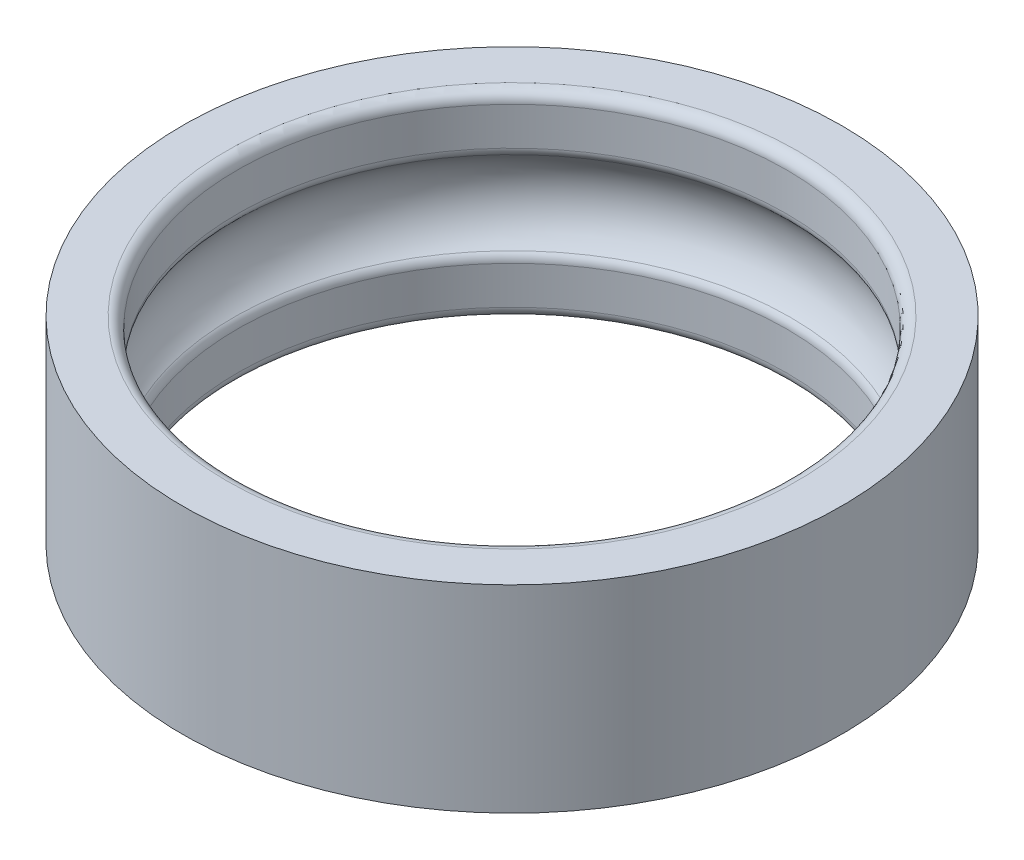
ISO-10303-21;
HEADER;
FILE_DESCRIPTION(('STEP AP214'),'2;1');
FILE_NAME('part.step','',(''),(''),'','','');
FILE_SCHEMA(('AUTOMOTIVE_DESIGN { 1 0 10303 214 1 1 1 1 }'));
ENDSEC;
DATA;
#1=APPLICATION_CONTEXT('core data for automotive mechanical design processes');
#2=APPLICATION_PROTOCOL_DEFINITION('international standard','automotive_design',2000,#1);
#3=PRODUCT_CONTEXT('',#1,'mechanical');
#4=PRODUCT('Part','Part','',(#3));
#5=PRODUCT_RELATED_PRODUCT_CATEGORY('part','',(#4));
#6=PRODUCT_DEFINITION_FORMATION('','',#4);
#7=PRODUCT_DEFINITION_CONTEXT('part definition',#1,'design');
#8=PRODUCT_DEFINITION('design','',#6,#7);
#9=PRODUCT_DEFINITION_SHAPE('','',#8);
#10=(LENGTH_UNIT() NAMED_UNIT(*) SI_UNIT(.MILLI.,.METRE.));
#11=(NAMED_UNIT(*) PLANE_ANGLE_UNIT() SI_UNIT($,.RADIAN.));
#12=(NAMED_UNIT(*) SI_UNIT($,.STERADIAN.) SOLID_ANGLE_UNIT());
#13=UNCERTAINTY_MEASURE_WITH_UNIT(LENGTH_MEASURE(1.E-05),#10,'distance_accuracy_value','');
#14=(GEOMETRIC_REPRESENTATION_CONTEXT(3) GLOBAL_UNCERTAINTY_ASSIGNED_CONTEXT((#13)) GLOBAL_UNIT_ASSIGNED_CONTEXT((#10,
#11,#12)) REPRESENTATION_CONTEXT('',''));
#15=CARTESIAN_POINT('',(0.,0.,0.));
#16=DIRECTION('',(0.,0.,1.));
#17=DIRECTION('',(1.,0.,0.));
#18=AXIS2_PLACEMENT_3D('',#15,#16,#17);
#19=CARTESIAN_POINT('',(0.,1.21039938313901,0.));
#20=DIRECTION('',(0.,-1.,0.));
#21=DIRECTION('',(0.,0.,-1.));
#22=AXIS2_PLACEMENT_3D('',#19,#20,#21);
#23=TOROIDAL_SURFACE('',#22,6.93333333342,0.26666666667);
#24=CARTESIAN_POINT('',(0.,1.01033336939702,0.));
#25=DIRECTION('',(0.,-1.,0.));
#26=DIRECTION('',(0.,0.,-1.));
#27=AXIS2_PLACEMENT_3D('',#24,#25,#26);
#28=CIRCLE('',#27,6.75702479347289);
#29=CARTESIAN_POINT('',(0.,1.01033336939702,-6.75702479347289));
#30=VERTEX_POINT('',#29);
#31=EDGE_CURVE('E80',#30,#30,#28,.T.);
#32=ORIENTED_EDGE('',*,*,#31,.T.);
#33=EDGE_LOOP('',(#32));
#34=FACE_BOUND('',#33,.T.);
#35=CARTESIAN_POINT('',(0.,1.21039938313901,0.));
#36=DIRECTION('',(0.,-1.,0.));
#37=DIRECTION('',(0.,0.,-1.));
#38=AXIS2_PLACEMENT_3D('',#35,#36,#37);
#39=CIRCLE('',#38,6.66666666675);
#40=CARTESIAN_POINT('',(0.,1.21039938313901,-6.66666666675));
#41=VERTEX_POINT('',#40);
#42=EDGE_CURVE('E10',#41,#41,#39,.T.);
#43=ORIENTED_EDGE('',*,*,#42,.F.);
#44=EDGE_LOOP('',(#43));
#45=FACE_BOUND('',#44,.T.);
#46=ADVANCED_FACE('F37',(#34,#45),#23,.T.);
#47=CARTESIAN_POINT('',(0.,0.,0.));
#48=DIRECTION('',(0.,-1.,0.));
#49=DIRECTION('',(0.,0.,-1.));
#50=AXIS2_PLACEMENT_3D('',#47,#48,#49);
#51=CYLINDRICAL_SURFACE('',#50,6.66666666675);
#52=ORIENTED_EDGE('',*,*,#42,.T.);
#53=EDGE_LOOP('',(#52));
#54=FACE_BOUND('',#53,.T.);
#55=CARTESIAN_POINT('',(0.,2.13333333336,0.));
#56=DIRECTION('',(0.,-1.,0.));
#57=DIRECTION('',(0.,0.,-1.));
#58=AXIS2_PLACEMENT_3D('',#55,#56,#57);
#59=CIRCLE('',#58,6.66666666675);
#60=CARTESIAN_POINT('',(0.,2.13333333336,-6.66666666675));
#61=VERTEX_POINT('',#60);
#62=EDGE_CURVE('E44',#61,#61,#59,.T.);
#63=ORIENTED_EDGE('',*,*,#62,.F.);
#64=EDGE_LOOP('',(#63));
#65=FACE_BOUND('',#64,.T.);
#66=ADVANCED_FACE('F99',(#54,#65),#51,.F.);
#67=CARTESIAN_POINT('',(0.,2.13333333336,0.));
#68=DIRECTION('',(0.,-1.,0.));
#69=DIRECTION('',(0.,0.,-1.));
#70=AXIS2_PLACEMENT_3D('',#67,#68,#69);
#71=TOROIDAL_SURFACE('',#70,6.93333333342,0.26666666667);
#72=ORIENTED_EDGE('',*,*,#62,.T.);
#73=EDGE_LOOP('',(#72));
#74=FACE_BOUND('',#73,.T.);
#75=CARTESIAN_POINT('',(0.,2.40000000003,0.));
#76=DIRECTION('',(0.,-1.,0.));
#77=DIRECTION('',(0.,0.,-1.));
#78=AXIS2_PLACEMENT_3D('',#75,#76,#77);
#79=CIRCLE('',#78,6.93333333342);
#80=CARTESIAN_POINT('',(0.,2.40000000003,-6.93333333342));
#81=VERTEX_POINT('',#80);
#82=EDGE_CURVE('E49',#81,#81,#79,.T.);
#83=ORIENTED_EDGE('',*,*,#82,.F.);
#84=EDGE_LOOP('',(#83));
#85=FACE_BOUND('',#84,.T.);
#86=ADVANCED_FACE('F103',(#74,#85),#71,.T.);
#87=CARTESIAN_POINT('',(0.,2.40000000003,-6.93333333342));
#88=DIRECTION('',(0.,1.,0.));
#89=DIRECTION('',(0.,0.,1.));
#90=AXIS2_PLACEMENT_3D('',#87,#88,#89);
#91=PLANE('',#90);
#92=ORIENTED_EDGE('',*,*,#82,.T.);
#93=EDGE_LOOP('',(#92));
#94=FACE_BOUND('',#93,.T.);
#95=CARTESIAN_POINT('',(0.,2.40000000003,0.));
#96=DIRECTION('',(0.,-1.,0.));
#97=DIRECTION('',(0.,0.,-1.));
#98=AXIS2_PLACEMENT_3D('',#95,#96,#97);
#99=CIRCLE('',#98,8.0000000001);
#100=CARTESIAN_POINT('',(0.,2.40000000003,-8.0000000001));
#101=VERTEX_POINT('',#100);
#102=EDGE_CURVE('E54',#101,#101,#99,.T.);
#103=ORIENTED_EDGE('',*,*,#102,.F.);
#104=EDGE_LOOP('',(#103));
#105=FACE_BOUND('',#104,.T.);
#106=ADVANCED_FACE('F107',(#94,#105),#91,.T.);
#107=CARTESIAN_POINT('',(0.,0.,0.));
#108=DIRECTION('',(0.,-1.,0.));
#109=DIRECTION('',(0.,0.,-1.));
#110=AXIS2_PLACEMENT_3D('',#107,#108,#109);
#111=CYLINDRICAL_SURFACE('',#110,8.0000000001);
#112=ORIENTED_EDGE('',*,*,#102,.T.);
#113=EDGE_LOOP('',(#112));
#114=FACE_BOUND('',#113,.T.);
#115=CARTESIAN_POINT('',(0.,-2.40000000003,0.));
#116=DIRECTION('',(0.,-1.,0.));
#117=DIRECTION('',(0.,0.,-1.));
#118=AXIS2_PLACEMENT_3D('',#115,#116,#117);
#119=CIRCLE('',#118,8.0000000001);
#120=CARTESIAN_POINT('',(0.,-2.40000000003,-8.0000000001));
#121=VERTEX_POINT('',#120);
#122=EDGE_CURVE('E60',#121,#121,#119,.T.);
#123=ORIENTED_EDGE('',*,*,#122,.F.);
#124=EDGE_LOOP('',(#123));
#125=FACE_BOUND('',#124,.T.);
#126=ADVANCED_FACE('F113',(#114,#125),#111,.T.);
#127=CARTESIAN_POINT('',(0.,-2.40000000003,-8.0000000001));
#128=DIRECTION('',(0.,-1.,0.));
#129=DIRECTION('',(0.,0.,-1.));
#130=AXIS2_PLACEMENT_3D('',#127,#128,#129);
#131=PLANE('',#130);
#132=ORIENTED_EDGE('',*,*,#122,.T.);
#133=EDGE_LOOP('',(#132));
#134=FACE_BOUND('',#133,.T.);
#135=CARTESIAN_POINT('',(0.,-2.40000000003,0.));
#136=DIRECTION('',(0.,-1.,0.));
#137=DIRECTION('',(0.,0.,-1.));
#138=AXIS2_PLACEMENT_3D('',#135,#136,#137);
#139=CIRCLE('',#138,6.93333333342);
#140=CARTESIAN_POINT('',(0.,-2.40000000003,-6.93333333342));
#141=VERTEX_POINT('',#140);
#142=EDGE_CURVE('E64',#141,#141,#139,.T.);
#143=ORIENTED_EDGE('',*,*,#142,.F.);
#144=EDGE_LOOP('',(#143));
#145=FACE_BOUND('',#144,.T.);
#146=ADVANCED_FACE('F117',(#134,#145),#131,.T.);
#147=CARTESIAN_POINT('',(0.,-2.13333333336,0.));
#148=DIRECTION('',(0.,-1.,0.));
#149=DIRECTION('',(0.,0.,-1.));
#150=AXIS2_PLACEMENT_3D('',#147,#148,#149);
#151=TOROIDAL_SURFACE('',#150,6.93333333342,0.26666666667);
#152=ORIENTED_EDGE('',*,*,#142,.T.);
#153=EDGE_LOOP('',(#152));
#154=FACE_BOUND('',#153,.T.);
#155=CARTESIAN_POINT('',(0.,-2.13333333336,0.));
#156=DIRECTION('',(0.,-1.,0.));
#157=DIRECTION('',(0.,0.,-1.));
#158=AXIS2_PLACEMENT_3D('',#155,#156,#157);
#159=CIRCLE('',#158,6.66666666675);
#160=CARTESIAN_POINT('',(0.,-2.13333333336,-6.66666666675));
#161=VERTEX_POINT('',#160);
#162=EDGE_CURVE('E68',#161,#161,#159,.T.);
#163=ORIENTED_EDGE('',*,*,#162,.F.);
#164=EDGE_LOOP('',(#163));
#165=FACE_BOUND('',#164,.T.);
#166=ADVANCED_FACE('F121',(#154,#165),#151,.T.);
#167=CARTESIAN_POINT('',(0.,0.,0.));
#168=DIRECTION('',(0.,-1.,0.));
#169=DIRECTION('',(0.,0.,-1.));
#170=AXIS2_PLACEMENT_3D('',#167,#168,#169);
#171=CYLINDRICAL_SURFACE('',#170,6.66666666675);
#172=ORIENTED_EDGE('',*,*,#162,.T.);
#173=EDGE_LOOP('',(#172));
#174=FACE_BOUND('',#173,.T.);
#175=CARTESIAN_POINT('',(0.,-1.21039938313901,0.));
#176=DIRECTION('',(0.,-1.,0.));
#177=DIRECTION('',(0.,0.,-1.));
#178=AXIS2_PLACEMENT_3D('',#175,#176,#177);
#179=CIRCLE('',#178,6.66666666675);
#180=CARTESIAN_POINT('',(0.,-1.21039938313901,-6.66666666675));
#181=VERTEX_POINT('',#180);
#182=EDGE_CURVE('E72',#181,#181,#179,.T.);
#183=ORIENTED_EDGE('',*,*,#182,.F.);
#184=EDGE_LOOP('',(#183));
#185=FACE_BOUND('',#184,.T.);
#186=ADVANCED_FACE('F95',(#174,#185),#171,.F.);
#187=CARTESIAN_POINT('',(0.,-1.21039938313901,0.));
#188=DIRECTION('',(0.,-1.,0.));
#189=DIRECTION('',(0.,0.,-1.));
#190=AXIS2_PLACEMENT_3D('',#187,#188,#189);
#191=TOROIDAL_SURFACE('',#190,6.93333333342,0.26666666667);
#192=ORIENTED_EDGE('',*,*,#182,.T.);
#193=EDGE_LOOP('',(#192));
#194=FACE_BOUND('',#193,.T.);
#195=CARTESIAN_POINT('',(0.,-1.01033336939702,0.));
#196=DIRECTION('',(0.,-1.,0.));
#197=DIRECTION('',(0.,0.,-1.));
#198=AXIS2_PLACEMENT_3D('',#195,#196,#197);
#199=CIRCLE('',#198,6.75702479347289);
#200=CARTESIAN_POINT('',(0.,-1.01033336939702,-6.75702479347289));
#201=VERTEX_POINT('',#200);
#202=EDGE_CURVE('E76',#201,#201,#199,.T.);
#203=ORIENTED_EDGE('',*,*,#202,.F.);
#204=EDGE_LOOP('',(#203));
#205=FACE_BOUND('',#204,.T.);
#206=ADVANCED_FACE('F89',(#194,#205),#191,.T.);
#207=CARTESIAN_POINT('',(0.,0.,0.));
#208=DIRECTION('',(0.,-1.,0.));
#209=DIRECTION('',(0.,0.,-1.));
#210=AXIS2_PLACEMENT_3D('',#207,#208,#209);
#211=TOROIDAL_SURFACE('',#210,5.86666666674,1.3466666666835);
#212=ORIENTED_EDGE('',*,*,#202,.T.);
#213=EDGE_LOOP('',(#212));
#214=FACE_BOUND('',#213,.T.);
#215=ORIENTED_EDGE('',*,*,#31,.F.);
#216=EDGE_LOOP('',(#215));
#217=FACE_BOUND('',#216,.T.);
#218=ADVANCED_FACE('F87',(#214,#217),#211,.F.);
#219=CLOSED_SHELL('',(#46,#66,#86,#106,#126,#146,#166,#186,#206,#218));
#220=MANIFOLD_SOLID_BREP('B2',#219);
#221=ADVANCED_BREP_SHAPE_REPRESENTATION('',(#18,#220),#14);
#222=SHAPE_DEFINITION_REPRESENTATION(#9,#221);
ENDSEC;
END-ISO-10303-21;
